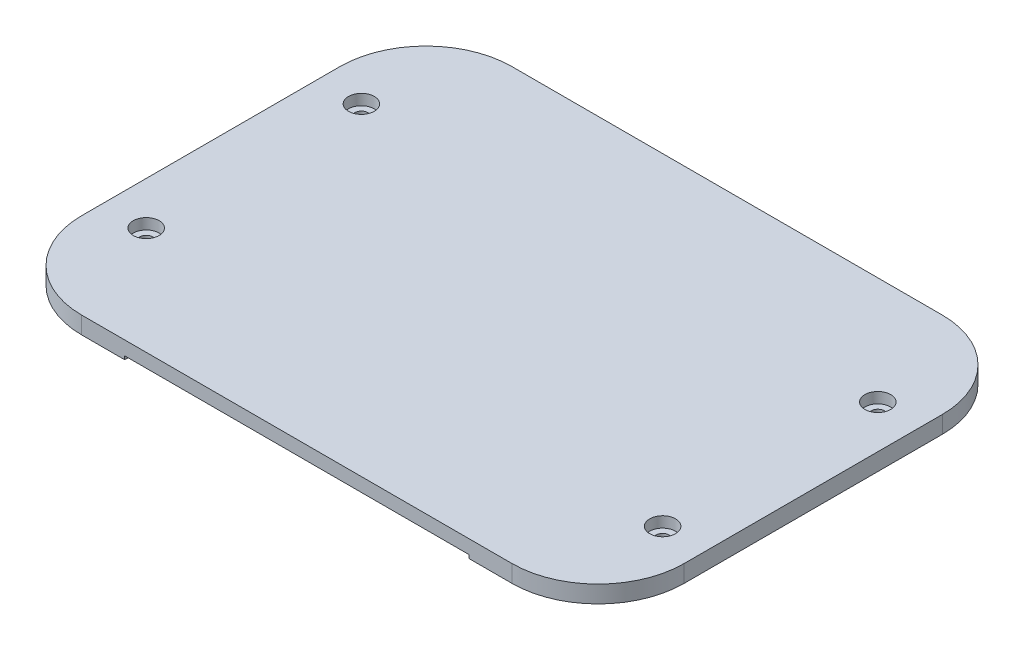
ISO-10303-21;
HEADER;
FILE_DESCRIPTION(('STEP AP214'),'2;1');
FILE_NAME('part.step','',(''),(''),'','','');
FILE_SCHEMA(('AUTOMOTIVE_DESIGN { 1 0 10303 214 1 1 1 1 }'));
ENDSEC;
DATA;
#1=APPLICATION_CONTEXT('core data for automotive mechanical design processes');
#2=APPLICATION_PROTOCOL_DEFINITION('international standard','automotive_design',2000,#1);
#3=PRODUCT_CONTEXT('',#1,'mechanical');
#4=PRODUCT('Part','Part','',(#3));
#5=PRODUCT_RELATED_PRODUCT_CATEGORY('part','',(#4));
#6=PRODUCT_DEFINITION_FORMATION('','',#4);
#7=PRODUCT_DEFINITION_CONTEXT('part definition',#1,'design');
#8=PRODUCT_DEFINITION('design','',#6,#7);
#9=PRODUCT_DEFINITION_SHAPE('','',#8);
#10=(LENGTH_UNIT() NAMED_UNIT(*) SI_UNIT(.MILLI.,.METRE.));
#11=(NAMED_UNIT(*) PLANE_ANGLE_UNIT() SI_UNIT($,.RADIAN.));
#12=(NAMED_UNIT(*) SI_UNIT($,.STERADIAN.) SOLID_ANGLE_UNIT());
#13=UNCERTAINTY_MEASURE_WITH_UNIT(LENGTH_MEASURE(1.E-05),#10,'distance_accuracy_value','');
#14=(GEOMETRIC_REPRESENTATION_CONTEXT(3) GLOBAL_UNCERTAINTY_ASSIGNED_CONTEXT((#13)) GLOBAL_UNIT_ASSIGNED_CONTEXT((#10,
#11,#12)) REPRESENTATION_CONTEXT('',''));
#15=CARTESIAN_POINT('',(0.,0.,0.));
#16=DIRECTION('',(0.,0.,1.));
#17=DIRECTION('',(1.,0.,0.));
#18=AXIS2_PLACEMENT_3D('',#15,#16,#17);
#19=CARTESIAN_POINT('',(10.,5.,25.));
#20=DIRECTION('',(0.,-1.,0.));
#21=DIRECTION('',(0.,0.,-1.));
#22=AXIS2_PLACEMENT_3D('',#19,#20,#21);
#23=CYLINDRICAL_SURFACE('',#22,1.5);
#24=CARTESIAN_POINT('',(10.,0.,25.));
#25=DIRECTION('',(0.,1.,0.));
#26=DIRECTION('',(0.,0.,1.));
#27=AXIS2_PLACEMENT_3D('',#24,#25,#26);
#28=CIRCLE('',#27,1.5);
#29=CARTESIAN_POINT('',(10.,0.,26.5));
#30=VERTEX_POINT('',#29);
#31=EDGE_CURVE('E276',#30,#30,#28,.T.);
#32=ORIENTED_EDGE('',*,*,#31,.F.);
#33=EDGE_LOOP('',(#32));
#34=FACE_BOUND('',#33,.T.);
#35=CARTESIAN_POINT('',(10.,1.5,25.));
#36=DIRECTION('',(0.,1.,0.));
#37=DIRECTION('',(0.,0.,1.));
#38=AXIS2_PLACEMENT_3D('',#35,#36,#37);
#39=CIRCLE('',#38,1.5);
#40=CARTESIAN_POINT('',(10.,1.5,26.5));
#41=VERTEX_POINT('',#40);
#42=EDGE_CURVE('E45',#41,#41,#39,.T.);
#43=ORIENTED_EDGE('',*,*,#42,.T.);
#44=EDGE_LOOP('',(#43));
#45=FACE_BOUND('',#44,.T.);
#46=ADVANCED_FACE('F41',(#34,#45),#23,.F.);
#47=CARTESIAN_POINT('',(10.,5.,75.));
#48=DIRECTION('',(0.,-1.,0.));
#49=DIRECTION('',(0.,0.,-1.));
#50=AXIS2_PLACEMENT_3D('',#47,#48,#49);
#51=CYLINDRICAL_SURFACE('',#50,1.5);
#52=CARTESIAN_POINT('',(10.,0.,75.));
#53=DIRECTION('',(0.,1.,0.));
#54=DIRECTION('',(0.,0.,1.));
#55=AXIS2_PLACEMENT_3D('',#52,#53,#54);
#56=CIRCLE('',#55,1.5);
#57=CARTESIAN_POINT('',(10.,0.,76.5));
#58=VERTEX_POINT('',#57);
#59=EDGE_CURVE('E272',#58,#58,#56,.T.);
#60=ORIENTED_EDGE('',*,*,#59,.F.);
#61=EDGE_LOOP('',(#60));
#62=FACE_BOUND('',#61,.T.);
#63=CARTESIAN_POINT('',(10.,1.5,75.));
#64=DIRECTION('',(0.,1.,0.));
#65=DIRECTION('',(0.,0.,1.));
#66=AXIS2_PLACEMENT_3D('',#63,#64,#65);
#67=CIRCLE('',#66,1.5);
#68=CARTESIAN_POINT('',(10.,1.5,76.5));
#69=VERTEX_POINT('',#68);
#70=EDGE_CURVE('E189',#69,#69,#67,.T.);
#71=ORIENTED_EDGE('',*,*,#70,.T.);
#72=EDGE_LOOP('',(#71));
#73=FACE_BOUND('',#72,.T.);
#74=ADVANCED_FACE('F425',(#62,#73),#51,.F.);
#75=CARTESIAN_POINT('',(130.,5.,75.));
#76=DIRECTION('',(0.,-1.,0.));
#77=DIRECTION('',(0.,0.,-1.));
#78=AXIS2_PLACEMENT_3D('',#75,#76,#77);
#79=CYLINDRICAL_SURFACE('',#78,1.5);
#80=CARTESIAN_POINT('',(130.,0.,75.));
#81=DIRECTION('',(0.,1.,0.));
#82=DIRECTION('',(0.,0.,1.));
#83=AXIS2_PLACEMENT_3D('',#80,#81,#82);
#84=CIRCLE('',#83,1.5);
#85=CARTESIAN_POINT('',(130.,0.,76.5));
#86=VERTEX_POINT('',#85);
#87=EDGE_CURVE('E268',#86,#86,#84,.T.);
#88=ORIENTED_EDGE('',*,*,#87,.F.);
#89=EDGE_LOOP('',(#88));
#90=FACE_BOUND('',#89,.T.);
#91=CARTESIAN_POINT('',(130.,1.5,75.));
#92=DIRECTION('',(0.,1.,0.));
#93=DIRECTION('',(0.,0.,1.));
#94=AXIS2_PLACEMENT_3D('',#91,#92,#93);
#95=CIRCLE('',#94,1.5);
#96=CARTESIAN_POINT('',(130.,1.5,76.5));
#97=VERTEX_POINT('',#96);
#98=EDGE_CURVE('E185',#97,#97,#95,.T.);
#99=ORIENTED_EDGE('',*,*,#98,.T.);
#100=EDGE_LOOP('',(#99));
#101=FACE_BOUND('',#100,.T.);
#102=ADVANCED_FACE('F431',(#90,#101),#79,.F.);
#103=CARTESIAN_POINT('',(130.,5.,25.));
#104=DIRECTION('',(0.,-1.,0.));
#105=DIRECTION('',(0.,0.,-1.));
#106=AXIS2_PLACEMENT_3D('',#103,#104,#105);
#107=CYLINDRICAL_SURFACE('',#106,1.5);
#108=CARTESIAN_POINT('',(130.,0.,25.));
#109=DIRECTION('',(0.,1.,0.));
#110=DIRECTION('',(0.,0.,1.));
#111=AXIS2_PLACEMENT_3D('',#108,#109,#110);
#112=CIRCLE('',#111,1.5);
#113=CARTESIAN_POINT('',(130.,0.,26.5));
#114=VERTEX_POINT('',#113);
#115=EDGE_CURVE('E256',#114,#114,#112,.T.);
#116=ORIENTED_EDGE('',*,*,#115,.F.);
#117=EDGE_LOOP('',(#116));
#118=FACE_BOUND('',#117,.T.);
#119=CARTESIAN_POINT('',(130.,1.5,25.));
#120=DIRECTION('',(0.,1.,0.));
#121=DIRECTION('',(0.,0.,1.));
#122=AXIS2_PLACEMENT_3D('',#119,#120,#121);
#123=CIRCLE('',#122,1.5);
#124=CARTESIAN_POINT('',(130.,1.5,26.5));
#125=VERTEX_POINT('',#124);
#126=EDGE_CURVE('E181',#125,#125,#123,.T.);
#127=ORIENTED_EDGE('',*,*,#126,.T.);
#128=EDGE_LOOP('',(#127));
#129=FACE_BOUND('',#128,.T.);
#130=ADVANCED_FACE('F440',(#118,#129),#107,.F.);
#131=CARTESIAN_POINT('',(0.,0.,0.));
#132=DIRECTION('',(0.,1.,0.));
#133=DIRECTION('',(0.,0.,1.));
#134=AXIS2_PLACEMENT_3D('',#131,#132,#133);
#135=PLANE('',#134);
#136=CARTESIAN_POINT('',(120.,0.,90.));
#137=DIRECTION('',(0.,-1.,0.));
#138=DIRECTION('',(0.,0.,-1.));
#139=AXIS2_PLACEMENT_3D('',#136,#137,#138);
#140=CIRCLE('',#139,5.10000000000001);
#141=CARTESIAN_POINT('',(120.,0.,84.9));
#142=VERTEX_POINT('',#141);
#143=EDGE_CURVE('E380',#142,#142,#140,.T.);
#144=ORIENTED_EDGE('',*,*,#143,.F.);
#145=EDGE_LOOP('',(#144));
#146=FACE_BOUND('',#145,.T.);
#147=CARTESIAN_POINT('',(120.,0.,10.));
#148=DIRECTION('',(0.,-1.,0.));
#149=DIRECTION('',(0.,0.,-1.));
#150=AXIS2_PLACEMENT_3D('',#147,#148,#149);
#151=CIRCLE('',#150,5.10000000000001);
#152=CARTESIAN_POINT('',(120.,0.,4.89999999999999));
#153=VERTEX_POINT('',#152);
#154=EDGE_CURVE('E366',#153,#153,#151,.T.);
#155=ORIENTED_EDGE('',*,*,#154,.F.);
#156=EDGE_LOOP('',(#155));
#157=FACE_BOUND('',#156,.T.);
#158=ORIENTED_EDGE('',*,*,#87,.T.);
#159=EDGE_LOOP('',(#158));
#160=FACE_BOUND('',#159,.T.);
#161=ORIENTED_EDGE('',*,*,#115,.T.);
#162=EDGE_LOOP('',(#161));
#163=FACE_BOUND('',#162,.T.);
#164=DIRECTION('',(1.,0.,0.));
#165=VECTOR('',#164,1.);
#166=CARTESIAN_POINT('',(0.,0.,100.));
#167=LINE('',#166,#165);
#168=CARTESIAN_POINT('',(110.,0.,100.));
#169=VERTEX_POINT('',#168);
#170=CARTESIAN_POINT('',(120.,0.,100.));
#171=VERTEX_POINT('',#170);
#172=EDGE_CURVE('E292',#169,#171,#167,.T.);
#173=ORIENTED_EDGE('',*,*,#172,.F.);
#174=DIRECTION('',(0.,0.,1.));
#175=VECTOR('',#174,1.);
#176=CARTESIAN_POINT('',(110.,0.,50.));
#177=LINE('',#176,#175);
#178=CARTESIAN_POINT('',(110.,0.,0.));
#179=VERTEX_POINT('',#178);
#180=EDGE_CURVE('E250',#179,#169,#177,.T.);
#181=ORIENTED_EDGE('',*,*,#180,.F.);
#182=DIRECTION('',(1.,0.,0.));
#183=VECTOR('',#182,1.);
#184=CARTESIAN_POINT('',(0.,0.,0.));
#185=LINE('',#184,#183);
#186=CARTESIAN_POINT('',(120.,0.,0.));
#187=VERTEX_POINT('',#186);
#188=EDGE_CURVE('E284',#179,#187,#185,.T.);
#189=ORIENTED_EDGE('',*,*,#188,.T.);
#190=CARTESIAN_POINT('',(120.,0.,20.));
#191=DIRECTION('',(0.,1.,0.));
#192=DIRECTION('',(0.,0.,1.));
#193=AXIS2_PLACEMENT_3D('',#190,#191,#192);
#194=CIRCLE('',#193,20.);
#195=CARTESIAN_POINT('',(140.,0.,20.));
#196=VERTEX_POINT('',#195);
#197=EDGE_CURVE('E165',#187,#196,#194,.F.);
#198=ORIENTED_EDGE('',*,*,#197,.T.);
#199=DIRECTION('',(0.,0.,1.));
#200=VECTOR('',#199,1.);
#201=CARTESIAN_POINT('',(140.,0.,0.));
#202=LINE('',#201,#200);
#203=CARTESIAN_POINT('',(140.,0.,80.));
#204=VERTEX_POINT('',#203);
#205=EDGE_CURVE('E280',#196,#204,#202,.T.);
#206=ORIENTED_EDGE('',*,*,#205,.T.);
#207=CARTESIAN_POINT('',(120.,0.,80.));
#208=DIRECTION('',(0.,1.,0.));
#209=DIRECTION('',(0.,0.,1.));
#210=AXIS2_PLACEMENT_3D('',#207,#208,#209);
#211=CIRCLE('',#210,20.);
#212=EDGE_CURVE('E306',#204,#171,#211,.F.);
#213=ORIENTED_EDGE('',*,*,#212,.T.);
#214=EDGE_LOOP('',(#173,#181,#189,#198,#206,#213));
#215=FACE_BOUND('',#214,.T.);
#216=ADVANCED_FACE('F315',(#146,#157,#160,#163,#215),#135,.F.);
#217=CARTESIAN_POINT('',(140.,5.,0.));
#218=DIRECTION('',(1.,0.,0.));
#219=DIRECTION('',(0.,0.,-1.));
#220=AXIS2_PLACEMENT_3D('',#217,#218,#219);
#221=PLANE('',#220);
#222=DIRECTION('',(0.,0.,-1.));
#223=VECTOR('',#222,1.);
#224=CARTESIAN_POINT('',(140.,4.,0.));
#225=LINE('',#224,#223);
#226=CARTESIAN_POINT('',(140.,4.,80.));
#227=VERTEX_POINT('',#226);
#228=CARTESIAN_POINT('',(140.,4.,20.));
#229=VERTEX_POINT('',#228);
#230=EDGE_CURVE('E237',#227,#229,#225,.T.);
#231=ORIENTED_EDGE('',*,*,#230,.F.);
#232=DIRECTION('',(0.,-1.,0.));
#233=VECTOR('',#232,1.);
#234=CARTESIAN_POINT('',(140.,0.,80.));
#235=LINE('',#234,#233);
#236=EDGE_CURVE('E51',#227,#204,#235,.T.);
#237=ORIENTED_EDGE('',*,*,#236,.T.);
#238=ORIENTED_EDGE('',*,*,#205,.F.);
#239=DIRECTION('',(0.,-1.,0.));
#240=VECTOR('',#239,1.);
#241=CARTESIAN_POINT('',(140.,5.,20.));
#242=LINE('',#241,#240);
#243=EDGE_CURVE('E11',#196,#229,#242,.F.);
#244=ORIENTED_EDGE('',*,*,#243,.T.);
#245=EDGE_LOOP('',(#231,#237,#238,#244));
#246=FACE_BOUND('',#245,.T.);
#247=ADVANCED_FACE('F323',(#246),#221,.T.);
#248=CARTESIAN_POINT('',(0.,5.,0.));
#249=DIRECTION('',(0.,0.,-1.));
#250=DIRECTION('',(-1.,0.,0.));
#251=AXIS2_PLACEMENT_3D('',#248,#249,#250);
#252=PLANE('',#251);
#253=DIRECTION('',(0.,-1.,0.));
#254=VECTOR('',#253,1.);
#255=CARTESIAN_POINT('',(110.,0.9,0.));
#256=LINE('',#255,#254);
#257=CARTESIAN_POINT('',(110.,0.8,0.));
#258=VERTEX_POINT('',#257);
#259=EDGE_CURVE('E253',#258,#179,#256,.T.);
#260=ORIENTED_EDGE('',*,*,#259,.F.);
#261=DIRECTION('',(1.,0.,0.));
#262=VECTOR('',#261,1.);
#263=CARTESIAN_POINT('',(30.,0.8,0.));
#264=LINE('',#263,#262);
#265=CARTESIAN_POINT('',(30.,0.8,0.));
#266=VERTEX_POINT('',#265);
#267=EDGE_CURVE('E350',#266,#258,#264,.T.);
#268=ORIENTED_EDGE('',*,*,#267,.F.);
#269=DIRECTION('',(0.,-1.,0.));
#270=VECTOR('',#269,1.);
#271=CARTESIAN_POINT('',(30.,0.9,0.));
#272=LINE('',#271,#270);
#273=CARTESIAN_POINT('',(30.,0.,0.));
#274=VERTEX_POINT('',#273);
#275=EDGE_CURVE('E257',#266,#274,#272,.T.);
#276=ORIENTED_EDGE('',*,*,#275,.T.);
#277=CARTESIAN_POINT('',(20.,0.,0.));
#278=VERTEX_POINT('',#277);
#279=EDGE_CURVE('E285',#278,#274,#185,.T.);
#280=ORIENTED_EDGE('',*,*,#279,.F.);
#281=DIRECTION('',(0.,-1.,0.));
#282=VECTOR('',#281,1.);
#283=CARTESIAN_POINT('',(20.,5.,0.));
#284=LINE('',#283,#282);
#285=CARTESIAN_POINT('',(20.,4.,0.));
#286=VERTEX_POINT('',#285);
#287=EDGE_CURVE('E163',#278,#286,#284,.F.);
#288=ORIENTED_EDGE('',*,*,#287,.T.);
#289=DIRECTION('',(-1.,0.,0.));
#290=VECTOR('',#289,1.);
#291=CARTESIAN_POINT('',(0.,4.,0.));
#292=LINE('',#291,#290);
#293=CARTESIAN_POINT('',(120.,4.,0.));
#294=VERTEX_POINT('',#293);
#295=EDGE_CURVE('E137',#294,#286,#292,.T.);
#296=ORIENTED_EDGE('',*,*,#295,.F.);
#297=DIRECTION('',(0.,-1.,0.));
#298=VECTOR('',#297,1.);
#299=CARTESIAN_POINT('',(120.,5.,0.));
#300=LINE('',#299,#298);
#301=EDGE_CURVE('E171',#294,#187,#300,.T.);
#302=ORIENTED_EDGE('',*,*,#301,.T.);
#303=ORIENTED_EDGE('',*,*,#188,.F.);
#304=EDGE_LOOP('',(#260,#268,#276,#280,#288,#296,#302,#303));
#305=FACE_BOUND('',#304,.T.);
#306=ADVANCED_FACE('F329',(#305),#252,.T.);
#307=CARTESIAN_POINT('',(0.,5.,0.));
#308=DIRECTION('',(1.,0.,0.));
#309=DIRECTION('',(0.,0.,-1.));
#310=AXIS2_PLACEMENT_3D('',#307,#308,#309);
#311=PLANE('',#310);
#312=DIRECTION('',(0.,-1.,0.));
#313=VECTOR('',#312,1.);
#314=CARTESIAN_POINT('',(0.,5.,80.));
#315=LINE('',#314,#313);
#316=CARTESIAN_POINT('',(0.,0.,80.));
#317=VERTEX_POINT('',#316);
#318=CARTESIAN_POINT('',(0.,4.,80.));
#319=VERTEX_POINT('',#318);
#320=EDGE_CURVE('E153',#317,#319,#315,.F.);
#321=ORIENTED_EDGE('',*,*,#320,.T.);
#322=DIRECTION('',(0.,0.,1.));
#323=VECTOR('',#322,1.);
#324=CARTESIAN_POINT('',(0.,4.,102.032930915841));
#325=LINE('',#324,#323);
#326=CARTESIAN_POINT('',(0.,4.,20.));
#327=VERTEX_POINT('',#326);
#328=EDGE_CURVE('E134',#327,#319,#325,.T.);
#329=ORIENTED_EDGE('',*,*,#328,.F.);
#330=DIRECTION('',(0.,-1.,0.));
#331=VECTOR('',#330,1.);
#332=CARTESIAN_POINT('',(0.,0.,20.));
#333=LINE('',#332,#331);
#334=CARTESIAN_POINT('',(0.,0.,20.));
#335=VERTEX_POINT('',#334);
#336=EDGE_CURVE('E150',#327,#335,#333,.T.);
#337=ORIENTED_EDGE('',*,*,#336,.T.);
#338=DIRECTION('',(0.,0.,1.));
#339=VECTOR('',#338,1.);
#340=CARTESIAN_POINT('',(0.,0.,0.));
#341=LINE('',#340,#339);
#342=EDGE_CURVE('E289',#335,#317,#341,.T.);
#343=ORIENTED_EDGE('',*,*,#342,.T.);
#344=EDGE_LOOP('',(#321,#329,#337,#343));
#345=FACE_BOUND('',#344,.T.);
#346=ADVANCED_FACE('F148',(#345),#311,.F.);
#347=CARTESIAN_POINT('',(0.,5.,100.));
#348=DIRECTION('',(0.,0.,-1.));
#349=DIRECTION('',(-1.,0.,0.));
#350=AXIS2_PLACEMENT_3D('',#347,#348,#349);
#351=PLANE('',#350);
#352=DIRECTION('',(-1.,0.,0.));
#353=VECTOR('',#352,1.);
#354=CARTESIAN_POINT('',(30.,0.8,100.));
#355=LINE('',#354,#353);
#356=CARTESIAN_POINT('',(110.,0.8,100.));
#357=VERTEX_POINT('',#356);
#358=CARTESIAN_POINT('',(30.,0.8,100.));
#359=VERTEX_POINT('',#358);
#360=EDGE_CURVE('E360',#357,#359,#355,.T.);
#361=ORIENTED_EDGE('',*,*,#360,.F.);
#362=DIRECTION('',(0.,-1.,0.));
#363=VECTOR('',#362,1.);
#364=CARTESIAN_POINT('',(110.,0.9,100.));
#365=LINE('',#364,#363);
#366=EDGE_CURVE('E64',#357,#169,#365,.T.);
#367=ORIENTED_EDGE('',*,*,#366,.T.);
#368=ORIENTED_EDGE('',*,*,#172,.T.);
#369=DIRECTION('',(0.,-1.,0.));
#370=VECTOR('',#369,1.);
#371=CARTESIAN_POINT('',(120.,5.,100.));
#372=LINE('',#371,#370);
#373=CARTESIAN_POINT('',(120.,4.,100.));
#374=VERTEX_POINT('',#373);
#375=EDGE_CURVE('E297',#171,#374,#372,.F.);
#376=ORIENTED_EDGE('',*,*,#375,.T.);
#377=DIRECTION('',(-1.,0.,0.));
#378=VECTOR('',#377,1.);
#379=CARTESIAN_POINT('',(0.,4.,100.));
#380=LINE('',#379,#378);
#381=CARTESIAN_POINT('',(20.,4.,100.));
#382=VERTEX_POINT('',#381);
#383=EDGE_CURVE('E233',#374,#382,#380,.T.);
#384=ORIENTED_EDGE('',*,*,#383,.T.);
#385=DIRECTION('',(0.,-1.,0.));
#386=VECTOR('',#385,1.);
#387=CARTESIAN_POINT('',(20.,5.,100.));
#388=LINE('',#387,#386);
#389=CARTESIAN_POINT('',(20.,0.,100.));
#390=VERTEX_POINT('',#389);
#391=EDGE_CURVE('E301',#382,#390,#388,.T.);
#392=ORIENTED_EDGE('',*,*,#391,.T.);
#393=CARTESIAN_POINT('',(30.,0.,100.));
#394=VERTEX_POINT('',#393);
#395=EDGE_CURVE('E293',#390,#394,#167,.T.);
#396=ORIENTED_EDGE('',*,*,#395,.T.);
#397=DIRECTION('',(0.,-1.,0.));
#398=VECTOR('',#397,1.);
#399=CARTESIAN_POINT('',(30.,0.9,100.));
#400=LINE('',#399,#398);
#401=EDGE_CURVE('E260',#359,#394,#400,.T.);
#402=ORIENTED_EDGE('',*,*,#401,.F.);
#403=EDGE_LOOP('',(#361,#367,#368,#376,#384,#392,#396,#402));
#404=FACE_BOUND('',#403,.T.);
#405=ADVANCED_FACE('F343',(#404),#351,.F.);
#406=CARTESIAN_POINT('',(20.,0.,9.99999999999999));
#407=DIRECTION('',(0.,-1.,0.));
#408=DIRECTION('',(0.,0.,-1.));
#409=AXIS2_PLACEMENT_3D('',#406,#407,#408);
#410=CIRCLE('',#409,4.88506614285927);
#411=CARTESIAN_POINT('',(20.,0.,5.11493385714072));
#412=VERTEX_POINT('',#411);
#413=EDGE_CURVE('E371',#412,#412,#410,.T.);
#414=ORIENTED_EDGE('',*,*,#413,.F.);
#415=EDGE_LOOP('',(#414));
#416=FACE_BOUND('',#415,.T.);
#417=CARTESIAN_POINT('',(20.,0.,90.));
#418=DIRECTION('',(0.,-1.,0.));
#419=DIRECTION('',(0.,0.,-1.));
#420=AXIS2_PLACEMENT_3D('',#417,#418,#419);
#421=CIRCLE('',#420,5.1);
#422=CARTESIAN_POINT('',(20.,0.,84.9));
#423=VERTEX_POINT('',#422);
#424=EDGE_CURVE('E379',#423,#423,#421,.T.);
#425=ORIENTED_EDGE('',*,*,#424,.F.);
#426=EDGE_LOOP('',(#425));
#427=FACE_BOUND('',#426,.T.);
#428=ORIENTED_EDGE('',*,*,#59,.T.);
#429=EDGE_LOOP('',(#428));
#430=FACE_BOUND('',#429,.T.);
#431=ORIENTED_EDGE('',*,*,#31,.T.);
#432=EDGE_LOOP('',(#431));
#433=FACE_BOUND('',#432,.T.);
#434=ORIENTED_EDGE('',*,*,#279,.T.);
#435=DIRECTION('',(0.,0.,-1.));
#436=VECTOR('',#435,1.);
#437=CARTESIAN_POINT('',(30.,0.,50.));
#438=LINE('',#437,#436);
#439=EDGE_CURVE('E246',#394,#274,#438,.T.);
#440=ORIENTED_EDGE('',*,*,#439,.F.);
#441=ORIENTED_EDGE('',*,*,#395,.F.);
#442=CARTESIAN_POINT('',(20.,0.,80.));
#443=DIRECTION('',(0.,1.,0.));
#444=DIRECTION('',(0.,0.,1.));
#445=AXIS2_PLACEMENT_3D('',#442,#443,#444);
#446=CIRCLE('',#445,20.);
#447=EDGE_CURVE('E159',#390,#317,#446,.F.);
#448=ORIENTED_EDGE('',*,*,#447,.T.);
#449=ORIENTED_EDGE('',*,*,#342,.F.);
#450=CARTESIAN_POINT('',(20.,0.,20.));
#451=DIRECTION('',(0.,1.,0.));
#452=DIRECTION('',(0.,0.,1.));
#453=AXIS2_PLACEMENT_3D('',#450,#451,#452);
#454=CIRCLE('',#453,20.);
#455=EDGE_CURVE('E156',#335,#278,#454,.F.);
#456=ORIENTED_EDGE('',*,*,#455,.T.);
#457=EDGE_LOOP('',(#434,#440,#441,#448,#449,#456));
#458=FACE_BOUND('',#457,.T.);
#459=ADVANCED_FACE('F334',(#416,#427,#430,#433,#458),#135,.F.);
#460=CARTESIAN_POINT('',(20.,5.,80.));
#461=DIRECTION('',(0.,-1.,0.));
#462=DIRECTION('',(0.,0.,-1.));
#463=AXIS2_PLACEMENT_3D('',#460,#461,#462);
#464=CYLINDRICAL_SURFACE('',#463,20.);
#465=CARTESIAN_POINT('',(20.,4.,80.));
#466=DIRECTION('',(0.,-1.,0.));
#467=DIRECTION('',(0.,0.,-1.));
#468=AXIS2_PLACEMENT_3D('',#465,#466,#467);
#469=CIRCLE('',#468,20.);
#470=EDGE_CURVE('E243',#319,#382,#469,.F.);
#471=ORIENTED_EDGE('',*,*,#470,.F.);
#472=ORIENTED_EDGE('',*,*,#320,.F.);
#473=ORIENTED_EDGE('',*,*,#447,.F.);
#474=ORIENTED_EDGE('',*,*,#391,.F.);
#475=EDGE_LOOP('',(#471,#472,#473,#474));
#476=FACE_BOUND('',#475,.T.);
#477=ADVANCED_FACE('F338',(#476),#464,.T.);
#478=CARTESIAN_POINT('',(120.,5.,20.));
#479=DIRECTION('',(0.,-1.,0.));
#480=DIRECTION('',(0.,0.,-1.));
#481=AXIS2_PLACEMENT_3D('',#478,#479,#480);
#482=CYLINDRICAL_SURFACE('',#481,20.);
#483=CARTESIAN_POINT('',(120.,4.,20.));
#484=DIRECTION('',(0.,-1.,0.));
#485=DIRECTION('',(0.,0.,-1.));
#486=AXIS2_PLACEMENT_3D('',#483,#484,#485);
#487=CIRCLE('',#486,20.);
#488=EDGE_CURVE('E240',#229,#294,#487,.F.);
#489=ORIENTED_EDGE('',*,*,#488,.F.);
#490=ORIENTED_EDGE('',*,*,#243,.F.);
#491=ORIENTED_EDGE('',*,*,#197,.F.);
#492=ORIENTED_EDGE('',*,*,#301,.F.);
#493=EDGE_LOOP('',(#489,#490,#491,#492));
#494=FACE_BOUND('',#493,.T.);
#495=ADVANCED_FACE('F327',(#494),#482,.T.);
#496=CARTESIAN_POINT('',(120.,5.,80.));
#497=DIRECTION('',(0.,1.,0.));
#498=DIRECTION('',(0.,0.,1.));
#499=AXIS2_PLACEMENT_3D('',#496,#497,#498);
#500=CYLINDRICAL_SURFACE('',#499,20.);
#501=CARTESIAN_POINT('',(120.,4.,80.));
#502=DIRECTION('',(0.,-1.,0.));
#503=DIRECTION('',(0.,0.,-1.));
#504=AXIS2_PLACEMENT_3D('',#501,#502,#503);
#505=CIRCLE('',#504,20.);
#506=EDGE_CURVE('E143',#374,#227,#505,.F.);
#507=ORIENTED_EDGE('',*,*,#506,.F.);
#508=ORIENTED_EDGE('',*,*,#375,.F.);
#509=ORIENTED_EDGE('',*,*,#212,.F.);
#510=ORIENTED_EDGE('',*,*,#236,.F.);
#511=EDGE_LOOP('',(#507,#508,#509,#510));
#512=FACE_BOUND('',#511,.T.);
#513=ADVANCED_FACE('F346',(#512),#500,.T.);
#514=CARTESIAN_POINT('',(20.,5.,20.));
#515=DIRECTION('',(0.,1.,0.));
#516=DIRECTION('',(0.,0.,1.));
#517=AXIS2_PLACEMENT_3D('',#514,#515,#516);
#518=CYLINDRICAL_SURFACE('',#517,20.);
#519=CARTESIAN_POINT('',(20.,4.,20.));
#520=DIRECTION('',(0.,-1.,0.));
#521=DIRECTION('',(0.,0.,-1.));
#522=AXIS2_PLACEMENT_3D('',#519,#520,#521);
#523=CIRCLE('',#522,20.);
#524=EDGE_CURVE('E130',#286,#327,#523,.F.);
#525=ORIENTED_EDGE('',*,*,#524,.F.);
#526=ORIENTED_EDGE('',*,*,#287,.F.);
#527=ORIENTED_EDGE('',*,*,#455,.F.);
#528=ORIENTED_EDGE('',*,*,#336,.F.);
#529=EDGE_LOOP('',(#525,#526,#527,#528));
#530=FACE_BOUND('',#529,.T.);
#531=ADVANCED_FACE('F43',(#530),#518,.T.);
#532=CARTESIAN_POINT('',(10.,2.,25.));
#533=DIRECTION('',(0.,1.,0.));
#534=DIRECTION('',(0.,0.,1.));
#535=AXIS2_PLACEMENT_3D('',#532,#533,#534);
#536=CYLINDRICAL_SURFACE('',#535,3.);
#537=CARTESIAN_POINT('',(10.,4.,25.));
#538=DIRECTION('',(0.,-1.,0.));
#539=DIRECTION('',(0.,0.,-1.));
#540=AXIS2_PLACEMENT_3D('',#537,#538,#539);
#541=CIRCLE('',#540,3.);
#542=CARTESIAN_POINT('',(10.,4.,22.));
#543=VERTEX_POINT('',#542);
#544=EDGE_CURVE('E144',#543,#543,#541,.F.);
#545=ORIENTED_EDGE('',*,*,#544,.T.);
#546=EDGE_LOOP('',(#545));
#547=FACE_BOUND('',#546,.T.);
#548=CARTESIAN_POINT('',(10.,1.5,25.));
#549=DIRECTION('',(0.,1.,0.));
#550=DIRECTION('',(0.,0.,1.));
#551=AXIS2_PLACEMENT_3D('',#548,#549,#550);
#552=CIRCLE('',#551,3.);
#553=CARTESIAN_POINT('',(10.,1.5,28.));
#554=VERTEX_POINT('',#553);
#555=EDGE_CURVE('E186',#554,#554,#552,.T.);
#556=ORIENTED_EDGE('',*,*,#555,.F.);
#557=EDGE_LOOP('',(#556));
#558=FACE_BOUND('',#557,.T.);
#559=ADVANCED_FACE('F420',(#547,#558),#536,.F.);
#560=CARTESIAN_POINT('',(130.,2.,75.));
#561=DIRECTION('',(0.,1.,0.));
#562=DIRECTION('',(0.,0.,1.));
#563=AXIS2_PLACEMENT_3D('',#560,#561,#562);
#564=CYLINDRICAL_SURFACE('',#563,2.99999999999999);
#565=CARTESIAN_POINT('',(130.,4.,75.));
#566=DIRECTION('',(0.,-1.,0.));
#567=DIRECTION('',(0.,0.,-1.));
#568=AXIS2_PLACEMENT_3D('',#565,#566,#567);
#569=CIRCLE('',#568,2.99999999999999);
#570=CARTESIAN_POINT('',(130.,4.,72.));
#571=VERTEX_POINT('',#570);
#572=EDGE_CURVE('E224',#571,#571,#569,.F.);
#573=ORIENTED_EDGE('',*,*,#572,.T.);
#574=EDGE_LOOP('',(#573));
#575=FACE_BOUND('',#574,.T.);
#576=CARTESIAN_POINT('',(130.,1.5,75.));
#577=DIRECTION('',(0.,1.,0.));
#578=DIRECTION('',(0.,0.,1.));
#579=AXIS2_PLACEMENT_3D('',#576,#577,#578);
#580=CIRCLE('',#579,2.99999999999999);
#581=CARTESIAN_POINT('',(130.,1.5,78.));
#582=VERTEX_POINT('',#581);
#583=EDGE_CURVE('E213',#582,#582,#580,.T.);
#584=ORIENTED_EDGE('',*,*,#583,.F.);
#585=EDGE_LOOP('',(#584));
#586=FACE_BOUND('',#585,.T.);
#587=ADVANCED_FACE('F410',(#575,#586),#564,.F.);
#588=CARTESIAN_POINT('',(130.,2.,25.));
#589=DIRECTION('',(0.,1.,0.));
#590=DIRECTION('',(0.,0.,1.));
#591=AXIS2_PLACEMENT_3D('',#588,#589,#590);
#592=CYLINDRICAL_SURFACE('',#591,2.99999999999999);
#593=CARTESIAN_POINT('',(130.,4.,25.));
#594=DIRECTION('',(0.,-1.,0.));
#595=DIRECTION('',(0.,0.,-1.));
#596=AXIS2_PLACEMENT_3D('',#593,#594,#595);
#597=CIRCLE('',#596,2.99999999999999);
#598=CARTESIAN_POINT('',(130.,4.,22.));
#599=VERTEX_POINT('',#598);
#600=EDGE_CURVE('E180',#599,#599,#597,.F.);
#601=ORIENTED_EDGE('',*,*,#600,.T.);
#602=EDGE_LOOP('',(#601));
#603=FACE_BOUND('',#602,.T.);
#604=CARTESIAN_POINT('',(130.,1.5,25.));
#605=DIRECTION('',(0.,1.,0.));
#606=DIRECTION('',(0.,0.,1.));
#607=AXIS2_PLACEMENT_3D('',#604,#605,#606);
#608=CIRCLE('',#607,2.99999999999999);
#609=CARTESIAN_POINT('',(130.,1.5,28.));
#610=VERTEX_POINT('',#609);
#611=EDGE_CURVE('E216',#610,#610,#608,.T.);
#612=ORIENTED_EDGE('',*,*,#611,.F.);
#613=EDGE_LOOP('',(#612));
#614=FACE_BOUND('',#613,.T.);
#615=ADVANCED_FACE('F407',(#603,#614),#592,.F.);
#616=CARTESIAN_POINT('',(10.,2.,75.));
#617=DIRECTION('',(0.,1.,0.));
#618=DIRECTION('',(0.,0.,1.));
#619=AXIS2_PLACEMENT_3D('',#616,#617,#618);
#620=CYLINDRICAL_SURFACE('',#619,3.);
#621=CARTESIAN_POINT('',(10.,4.,75.));
#622=DIRECTION('',(0.,-1.,0.));
#623=DIRECTION('',(0.,0.,-1.));
#624=AXIS2_PLACEMENT_3D('',#621,#622,#623);
#625=CIRCLE('',#624,3.);
#626=CARTESIAN_POINT('',(10.,4.,72.));
#627=VERTEX_POINT('',#626);
#628=EDGE_CURVE('E176',#627,#627,#625,.F.);
#629=ORIENTED_EDGE('',*,*,#628,.T.);
#630=EDGE_LOOP('',(#629));
#631=FACE_BOUND('',#630,.T.);
#632=CARTESIAN_POINT('',(10.,1.5,75.));
#633=DIRECTION('',(0.,1.,0.));
#634=DIRECTION('',(0.,0.,1.));
#635=AXIS2_PLACEMENT_3D('',#632,#633,#634);
#636=CIRCLE('',#635,3.);
#637=CARTESIAN_POINT('',(10.,1.5,78.));
#638=VERTEX_POINT('',#637);
#639=EDGE_CURVE('E209',#638,#638,#636,.T.);
#640=ORIENTED_EDGE('',*,*,#639,.F.);
#641=EDGE_LOOP('',(#640));
#642=FACE_BOUND('',#641,.T.);
#643=ADVANCED_FACE('F409',(#631,#642),#620,.F.);
#644=CARTESIAN_POINT('',(110.,0.9,50.));
#645=DIRECTION('',(1.,0.,0.));
#646=DIRECTION('',(0.,0.,-1.));
#647=AXIS2_PLACEMENT_3D('',#644,#645,#646);
#648=PLANE('',#647);
#649=ORIENTED_EDGE('',*,*,#366,.F.);
#650=DIRECTION('',(0.,0.,1.));
#651=VECTOR('',#650,1.);
#652=CARTESIAN_POINT('',(110.,0.8,100.));
#653=LINE('',#652,#651);
#654=EDGE_CURVE('E59',#258,#357,#653,.T.);
#655=ORIENTED_EDGE('',*,*,#654,.F.);
#656=ORIENTED_EDGE('',*,*,#259,.T.);
#657=ORIENTED_EDGE('',*,*,#180,.T.);
#658=EDGE_LOOP('',(#649,#655,#656,#657));
#659=FACE_BOUND('',#658,.T.);
#660=ADVANCED_FACE('F417',(#659),#648,.F.);
#661=CARTESIAN_POINT('',(30.,0.9,50.));
#662=DIRECTION('',(-1.,0.,0.));
#663=DIRECTION('',(0.,0.,1.));
#664=AXIS2_PLACEMENT_3D('',#661,#662,#663);
#665=PLANE('',#664);
#666=ORIENTED_EDGE('',*,*,#275,.F.);
#667=DIRECTION('',(0.,0.,-1.));
#668=VECTOR('',#667,1.);
#669=CARTESIAN_POINT('',(30.,0.8,100.));
#670=LINE('',#669,#668);
#671=EDGE_CURVE('E355',#359,#266,#670,.T.);
#672=ORIENTED_EDGE('',*,*,#671,.F.);
#673=ORIENTED_EDGE('',*,*,#401,.T.);
#674=ORIENTED_EDGE('',*,*,#439,.T.);
#675=EDGE_LOOP('',(#666,#672,#673,#674));
#676=FACE_BOUND('',#675,.T.);
#677=ADVANCED_FACE('F516',(#676),#665,.F.);
#678=CARTESIAN_POINT('',(0.,4.,0.));
#679=DIRECTION('',(0.,-1.,0.));
#680=DIRECTION('',(0.,0.,-1.));
#681=AXIS2_PLACEMENT_3D('',#678,#679,#680);
#682=PLANE('',#681);
#683=ORIENTED_EDGE('',*,*,#470,.T.);
#684=ORIENTED_EDGE('',*,*,#383,.F.);
#685=ORIENTED_EDGE('',*,*,#506,.T.);
#686=ORIENTED_EDGE('',*,*,#230,.T.);
#687=ORIENTED_EDGE('',*,*,#488,.T.);
#688=ORIENTED_EDGE('',*,*,#295,.T.);
#689=ORIENTED_EDGE('',*,*,#524,.T.);
#690=ORIENTED_EDGE('',*,*,#328,.T.);
#691=EDGE_LOOP('',(#683,#684,#685,#686,#687,#688,#689,#690));
#692=FACE_BOUND('',#691,.T.);
#693=ORIENTED_EDGE('',*,*,#572,.F.);
#694=EDGE_LOOP('',(#693));
#695=FACE_BOUND('',#694,.T.);
#696=ORIENTED_EDGE('',*,*,#628,.F.);
#697=EDGE_LOOP('',(#696));
#698=FACE_BOUND('',#697,.T.);
#699=ORIENTED_EDGE('',*,*,#600,.F.);
#700=EDGE_LOOP('',(#699));
#701=FACE_BOUND('',#700,.T.);
#702=ORIENTED_EDGE('',*,*,#544,.F.);
#703=EDGE_LOOP('',(#702));
#704=FACE_BOUND('',#703,.T.);
#705=ADVANCED_FACE('F132',(#692,#695,#698,#701,#704),#682,.F.);
#706=CARTESIAN_POINT('',(10.,1.5,75.));
#707=DIRECTION('',(0.,1.,0.));
#708=DIRECTION('',(0.,0.,1.));
#709=AXIS2_PLACEMENT_3D('',#706,#707,#708);
#710=PLANE('',#709);
#711=ORIENTED_EDGE('',*,*,#70,.F.);
#712=EDGE_LOOP('',(#711));
#713=FACE_BOUND('',#712,.T.);
#714=ORIENTED_EDGE('',*,*,#639,.T.);
#715=EDGE_LOOP('',(#714));
#716=FACE_BOUND('',#715,.T.);
#717=ADVANCED_FACE('F486',(#713,#716),#710,.T.);
#718=CARTESIAN_POINT('',(130.,1.5,25.));
#719=DIRECTION('',(0.,1.,0.));
#720=DIRECTION('',(0.,0.,1.));
#721=AXIS2_PLACEMENT_3D('',#718,#719,#720);
#722=PLANE('',#721);
#723=ORIENTED_EDGE('',*,*,#126,.F.);
#724=EDGE_LOOP('',(#723));
#725=FACE_BOUND('',#724,.T.);
#726=ORIENTED_EDGE('',*,*,#611,.T.);
#727=EDGE_LOOP('',(#726));
#728=FACE_BOUND('',#727,.T.);
#729=ADVANCED_FACE('F405',(#725,#728),#722,.T.);
#730=CARTESIAN_POINT('',(130.,1.5,75.));
#731=DIRECTION('',(0.,1.,0.));
#732=DIRECTION('',(0.,0.,1.));
#733=AXIS2_PLACEMENT_3D('',#730,#731,#732);
#734=PLANE('',#733);
#735=ORIENTED_EDGE('',*,*,#98,.F.);
#736=EDGE_LOOP('',(#735));
#737=FACE_BOUND('',#736,.T.);
#738=ORIENTED_EDGE('',*,*,#583,.T.);
#739=EDGE_LOOP('',(#738));
#740=FACE_BOUND('',#739,.T.);
#741=ADVANCED_FACE('F203',(#737,#740),#734,.T.);
#742=CARTESIAN_POINT('',(10.,1.5,25.));
#743=DIRECTION('',(0.,1.,0.));
#744=DIRECTION('',(0.,0.,1.));
#745=AXIS2_PLACEMENT_3D('',#742,#743,#744);
#746=PLANE('',#745);
#747=ORIENTED_EDGE('',*,*,#42,.F.);
#748=EDGE_LOOP('',(#747));
#749=FACE_BOUND('',#748,.T.);
#750=ORIENTED_EDGE('',*,*,#555,.T.);
#751=EDGE_LOOP('',(#750));
#752=FACE_BOUND('',#751,.T.);
#753=ADVANCED_FACE('F199',(#749,#752),#746,.T.);
#754=CARTESIAN_POINT('',(20.,3.,90.));
#755=DIRECTION('',(0.,-1.,0.));
#756=DIRECTION('',(0.,0.,-1.));
#757=AXIS2_PLACEMENT_3D('',#754,#755,#756);
#758=CYLINDRICAL_SURFACE('',#757,5.1);
#759=CARTESIAN_POINT('',(20.,3.,90.));
#760=DIRECTION('',(0.,-1.,0.));
#761=DIRECTION('',(0.,0.,-1.));
#762=AXIS2_PLACEMENT_3D('',#759,#760,#761);
#763=CIRCLE('',#762,5.1);
#764=CARTESIAN_POINT('',(20.,3.,84.9));
#765=VERTEX_POINT('',#764);
#766=EDGE_CURVE('E391',#765,#765,#763,.T.);
#767=ORIENTED_EDGE('',*,*,#766,.F.);
#768=EDGE_LOOP('',(#767));
#769=FACE_BOUND('',#768,.T.);
#770=ORIENTED_EDGE('',*,*,#424,.T.);
#771=EDGE_LOOP('',(#770));
#772=FACE_BOUND('',#771,.T.);
#773=ADVANCED_FACE('F202',(#769,#772),#758,.F.);
#774=CARTESIAN_POINT('',(20.,3.,9.99999999999999));
#775=DIRECTION('',(0.,-1.,0.));
#776=DIRECTION('',(0.,0.,-1.));
#777=AXIS2_PLACEMENT_3D('',#774,#775,#776);
#778=CYLINDRICAL_SURFACE('',#777,4.88506614285927);
#779=CARTESIAN_POINT('',(20.,3.,9.99999999999999));
#780=DIRECTION('',(0.,-1.,0.));
#781=DIRECTION('',(0.,0.,-1.));
#782=AXIS2_PLACEMENT_3D('',#779,#780,#781);
#783=CIRCLE('',#782,4.88506614285927);
#784=CARTESIAN_POINT('',(20.,3.,5.11493385714072));
#785=VERTEX_POINT('',#784);
#786=EDGE_CURVE('E384',#785,#785,#783,.T.);
#787=ORIENTED_EDGE('',*,*,#786,.F.);
#788=EDGE_LOOP('',(#787));
#789=FACE_BOUND('',#788,.T.);
#790=ORIENTED_EDGE('',*,*,#413,.T.);
#791=EDGE_LOOP('',(#790));
#792=FACE_BOUND('',#791,.T.);
#793=ADVANCED_FACE('F577',(#789,#792),#778,.F.);
#794=CARTESIAN_POINT('',(120.,3.,10.));
#795=DIRECTION('',(0.,-1.,0.));
#796=DIRECTION('',(0.,0.,-1.));
#797=AXIS2_PLACEMENT_3D('',#794,#795,#796);
#798=CYLINDRICAL_SURFACE('',#797,5.10000000000001);
#799=CARTESIAN_POINT('',(120.,3.,10.));
#800=DIRECTION('',(0.,-1.,0.));
#801=DIRECTION('',(0.,0.,-1.));
#802=AXIS2_PLACEMENT_3D('',#799,#800,#801);
#803=CIRCLE('',#802,5.10000000000001);
#804=CARTESIAN_POINT('',(120.,3.,4.89999999999999));
#805=VERTEX_POINT('',#804);
#806=EDGE_CURVE('E367',#805,#805,#803,.T.);
#807=ORIENTED_EDGE('',*,*,#806,.F.);
#808=EDGE_LOOP('',(#807));
#809=FACE_BOUND('',#808,.T.);
#810=ORIENTED_EDGE('',*,*,#154,.T.);
#811=EDGE_LOOP('',(#810));
#812=FACE_BOUND('',#811,.T.);
#813=ADVANCED_FACE('F587',(#809,#812),#798,.F.);
#814=CARTESIAN_POINT('',(120.,3.,90.));
#815=DIRECTION('',(0.,-1.,0.));
#816=DIRECTION('',(0.,0.,-1.));
#817=AXIS2_PLACEMENT_3D('',#814,#815,#816);
#818=CYLINDRICAL_SURFACE('',#817,5.10000000000001);
#819=CARTESIAN_POINT('',(120.,3.,90.));
#820=DIRECTION('',(0.,-1.,0.));
#821=DIRECTION('',(0.,0.,-1.));
#822=AXIS2_PLACEMENT_3D('',#819,#820,#821);
#823=CIRCLE('',#822,5.10000000000001);
#824=CARTESIAN_POINT('',(120.,3.,84.9));
#825=VERTEX_POINT('',#824);
#826=EDGE_CURVE('E375',#825,#825,#823,.T.);
#827=ORIENTED_EDGE('',*,*,#826,.F.);
#828=EDGE_LOOP('',(#827));
#829=FACE_BOUND('',#828,.T.);
#830=ORIENTED_EDGE('',*,*,#143,.T.);
#831=EDGE_LOOP('',(#830));
#832=FACE_BOUND('',#831,.T.);
#833=ADVANCED_FACE('F512',(#829,#832),#818,.F.);
#834=CARTESIAN_POINT('',(20.,3.,9.99999999999999));
#835=DIRECTION('',(0.,1.,0.));
#836=DIRECTION('',(0.,0.,1.));
#837=AXIS2_PLACEMENT_3D('',#834,#835,#836);
#838=PLANE('',#837);
#839=ORIENTED_EDGE('',*,*,#786,.T.);
#840=EDGE_LOOP('',(#839));
#841=FACE_BOUND('',#840,.T.);
#842=ADVANCED_FACE('F508',(#841),#838,.F.);
#843=CARTESIAN_POINT('',(120.,3.,10.));
#844=DIRECTION('',(0.,1.,0.));
#845=DIRECTION('',(0.,0.,1.));
#846=AXIS2_PLACEMENT_3D('',#843,#844,#845);
#847=PLANE('',#846);
#848=ORIENTED_EDGE('',*,*,#806,.T.);
#849=EDGE_LOOP('',(#848));
#850=FACE_BOUND('',#849,.T.);
#851=ADVANCED_FACE('F504',(#850),#847,.F.);
#852=CARTESIAN_POINT('',(120.,3.,90.));
#853=DIRECTION('',(0.,1.,0.));
#854=DIRECTION('',(0.,0.,1.));
#855=AXIS2_PLACEMENT_3D('',#852,#853,#854);
#856=PLANE('',#855);
#857=ORIENTED_EDGE('',*,*,#826,.T.);
#858=EDGE_LOOP('',(#857));
#859=FACE_BOUND('',#858,.T.);
#860=ADVANCED_FACE('F500',(#859),#856,.F.);
#861=CARTESIAN_POINT('',(20.,3.,90.));
#862=DIRECTION('',(0.,1.,0.));
#863=DIRECTION('',(0.,0.,1.));
#864=AXIS2_PLACEMENT_3D('',#861,#862,#863);
#865=PLANE('',#864);
#866=ORIENTED_EDGE('',*,*,#766,.T.);
#867=EDGE_LOOP('',(#866));
#868=FACE_BOUND('',#867,.T.);
#869=ADVANCED_FACE('F497',(#868),#865,.F.);
#870=CARTESIAN_POINT('',(0.,0.8,0.));
#871=DIRECTION('',(0.,-1.,0.));
#872=DIRECTION('',(0.,0.,-1.));
#873=AXIS2_PLACEMENT_3D('',#870,#871,#872);
#874=PLANE('',#873);
#875=ORIENTED_EDGE('',*,*,#671,.T.);
#876=ORIENTED_EDGE('',*,*,#267,.T.);
#877=ORIENTED_EDGE('',*,*,#654,.T.);
#878=ORIENTED_EDGE('',*,*,#360,.T.);
#879=EDGE_LOOP('',(#875,#876,#877,#878));
#880=FACE_BOUND('',#879,.T.);
#881=ADVANCED_FACE('F353',(#880),#874,.T.);
#882=CLOSED_SHELL('',(#46,#74,#102,#130,#216,#247,#306,#346,#405,#459,#477,#495,#513,#531,#559,
#587,#615,#643,#660,#677,#705,#717,#729,#741,#753,#773,#793,#813,#833,#842,#851,#860,#869,#881));
#883=MANIFOLD_SOLID_BREP('B2',#882);
#884=ADVANCED_BREP_SHAPE_REPRESENTATION('',(#18,#883),#14);
#885=SHAPE_DEFINITION_REPRESENTATION(#9,#884);
ENDSEC;
END-ISO-10303-21;
